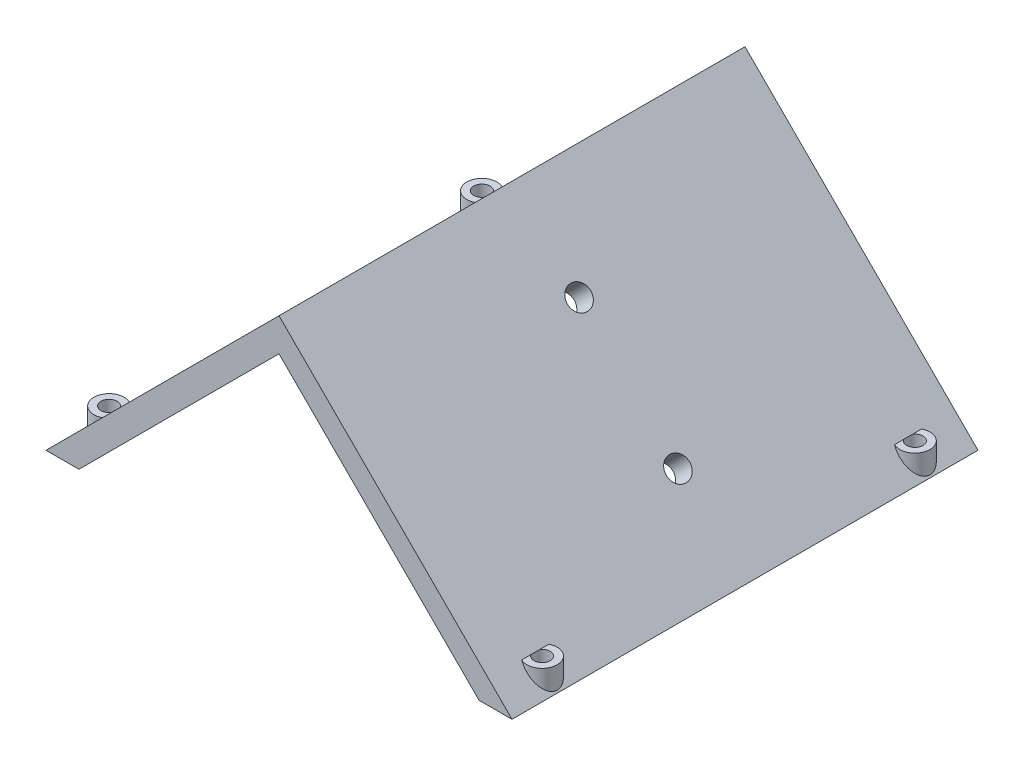
ISO-10303-21;
HEADER;
FILE_DESCRIPTION(('STEP AP214'),'2;1');
FILE_NAME('part.step','',(''),(''),'','','');
FILE_SCHEMA(('AUTOMOTIVE_DESIGN { 1 0 10303 214 1 1 1 1 }'));
ENDSEC;
DATA;
#1=APPLICATION_CONTEXT('core data for automotive mechanical design processes');
#2=APPLICATION_PROTOCOL_DEFINITION('international standard','automotive_design',2000,#1);
#3=PRODUCT_CONTEXT('',#1,'mechanical');
#4=PRODUCT('Part','Part','',(#3));
#5=PRODUCT_RELATED_PRODUCT_CATEGORY('part','',(#4));
#6=PRODUCT_DEFINITION_FORMATION('','',#4);
#7=PRODUCT_DEFINITION_CONTEXT('part definition',#1,'design');
#8=PRODUCT_DEFINITION('design','',#6,#7);
#9=PRODUCT_DEFINITION_SHAPE('','',#8);
#10=(LENGTH_UNIT() NAMED_UNIT(*) SI_UNIT(.MILLI.,.METRE.));
#11=(NAMED_UNIT(*) PLANE_ANGLE_UNIT() SI_UNIT($,.RADIAN.));
#12=(NAMED_UNIT(*) SI_UNIT($,.STERADIAN.) SOLID_ANGLE_UNIT());
#13=UNCERTAINTY_MEASURE_WITH_UNIT(LENGTH_MEASURE(1.E-05),#10,'distance_accuracy_value','');
#14=(GEOMETRIC_REPRESENTATION_CONTEXT(3) GLOBAL_UNCERTAINTY_ASSIGNED_CONTEXT((#13)) GLOBAL_UNIT_ASSIGNED_CONTEXT((#10,
#11,#12)) REPRESENTATION_CONTEXT('',''));
#15=CARTESIAN_POINT('',(0.,0.,0.));
#16=DIRECTION('',(0.,0.,1.));
#17=DIRECTION('',(1.,0.,0.));
#18=AXIS2_PLACEMENT_3D('',#15,#16,#17);
#19=CARTESIAN_POINT('',(0.,7.1,100.));
#20=DIRECTION('',(0.707106781186547,-0.707106781186548,0.));
#21=DIRECTION('',(0.707106781186548,0.707106781186547,0.));
#22=AXIS2_PLACEMENT_3D('',#19,#20,#21);
#23=PLANE('',#22);
#24=DIRECTION('',(0.,0.,-1.));
#25=VECTOR('',#24,1.);
#26=CARTESIAN_POINT('',(5.,12.1,100.));
#27=LINE('',#26,#25);
#28=CARTESIAN_POINT('',(5.,12.1,90.9580391742134));
#29=VERTEX_POINT('',#28);
#30=CARTESIAN_POINT('',(5.00000000000001,12.1,89.0419608257867));
#31=VERTEX_POINT('',#30);
#32=EDGE_CURVE('E136',#29,#31,#27,.T.);
#33=ORIENTED_EDGE('',*,*,#32,.F.);
#34=DIRECTION('',(0.,0.,-1.));
#35=VECTOR('',#34,1.);
#36=CARTESIAN_POINT('',(5.,12.1,100.));
#37=LINE('',#36,#35);
#38=CARTESIAN_POINT('',(5.,12.1,92.901351247148));
#39=VERTEX_POINT('',#38);
#40=EDGE_CURVE('E151',#39,#29,#37,.T.);
#41=ORIENTED_EDGE('',*,*,#40,.F.);
#42=CARTESIAN_POINT('',(3.53553390593275,10.6355339059327,90.));
#43=DIRECTION('',(0.707106781186547,-0.707106781186548,0.));
#44=DIRECTION('',(-0.707106781186548,-0.707106781186547,0.));
#45=AXIS2_PLACEMENT_3D('',#42,#43,#44);
#46=ELLIPSE('',#45,4.59619407771257,3.25000000000001);
#47=CARTESIAN_POINT('',(5.,12.1,87.098648752852));
#48=VERTEX_POINT('',#47);
#49=EDGE_CURVE('E165',#48,#39,#46,.F.);
#50=ORIENTED_EDGE('',*,*,#49,.F.);
#51=EDGE_CURVE('E261',#31,#48,#37,.T.);
#52=ORIENTED_EDGE('',*,*,#51,.F.);
#53=EDGE_LOOP('',(#33,#41,#50,#52));
#54=FACE_BOUND('',#53,.T.);
#55=DIRECTION('',(-0.707106781186548,-0.707106781186547,0.));
#56=VECTOR('',#55,1.);
#57=CARTESIAN_POINT('',(0.,7.1,0.));
#58=LINE('',#57,#56);
#59=CARTESIAN_POINT('',(50.,57.1,0.));
#60=VERTEX_POINT('',#59);
#61=CARTESIAN_POINT('',(0.,7.1,0.));
#62=VERTEX_POINT('',#61);
#63=EDGE_CURVE('E224',#60,#62,#58,.T.);
#64=ORIENTED_EDGE('',*,*,#63,.T.);
#65=DIRECTION('',(0.,0.,-1.));
#66=VECTOR('',#65,1.);
#67=CARTESIAN_POINT('',(0.,7.1,100.));
#68=LINE('',#67,#66);
#69=CARTESIAN_POINT('',(0.,7.1,100.));
#70=VERTEX_POINT('',#69);
#71=EDGE_CURVE('E239',#70,#62,#68,.T.);
#72=ORIENTED_EDGE('',*,*,#71,.F.);
#73=DIRECTION('',(-0.707106781186548,-0.707106781186547,0.));
#74=VECTOR('',#73,1.);
#75=CARTESIAN_POINT('',(0.,7.1,100.));
#76=LINE('',#75,#74);
#77=CARTESIAN_POINT('',(50.,57.1,100.));
#78=VERTEX_POINT('',#77);
#79=EDGE_CURVE('E209',#78,#70,#76,.T.);
#80=ORIENTED_EDGE('',*,*,#79,.F.);
#81=DIRECTION('',(0.,0.,-1.));
#82=VECTOR('',#81,1.);
#83=CARTESIAN_POINT('',(50.,57.1,100.));
#84=LINE('',#83,#82);
#85=EDGE_CURVE('E242',#78,#60,#84,.T.);
#86=ORIENTED_EDGE('',*,*,#85,.T.);
#87=EDGE_LOOP('',(#64,#72,#80,#86));
#88=FACE_BOUND('',#87,.T.);
#89=DIRECTION('',(0.,0.,-1.));
#90=VECTOR('',#89,1.);
#91=CARTESIAN_POINT('',(5.,12.1,100.));
#92=LINE('',#91,#90);
#93=CARTESIAN_POINT('',(5.,12.1,10.9580391742133));
#94=VERTEX_POINT('',#93);
#95=CARTESIAN_POINT('',(5.,12.1,9.04196082578667));
#96=VERTEX_POINT('',#95);
#97=EDGE_CURVE('E133',#94,#96,#92,.T.);
#98=ORIENTED_EDGE('',*,*,#97,.F.);
#99=DIRECTION('',(0.,0.,-1.));
#100=VECTOR('',#99,1.);
#101=CARTESIAN_POINT('',(5.,12.1,100.));
#102=LINE('',#101,#100);
#103=CARTESIAN_POINT('',(5.,12.1,12.901351247148));
#104=VERTEX_POINT('',#103);
#105=EDGE_CURVE('E11',#104,#94,#102,.T.);
#106=ORIENTED_EDGE('',*,*,#105,.F.);
#107=CARTESIAN_POINT('',(3.53553390593274,10.6355339059327,10.));
#108=DIRECTION('',(0.707106781186547,-0.707106781186548,0.));
#109=DIRECTION('',(-0.707106781186548,-0.707106781186547,0.));
#110=AXIS2_PLACEMENT_3D('',#107,#108,#109);
#111=ELLIPSE('',#110,4.59619407771257,3.25000000000001);
#112=CARTESIAN_POINT('',(5.,12.1,7.09864875285197));
#113=VERTEX_POINT('',#112);
#114=EDGE_CURVE('E147',#113,#104,#111,.F.);
#115=ORIENTED_EDGE('',*,*,#114,.F.);
#116=EDGE_CURVE('E41',#96,#113,#102,.T.);
#117=ORIENTED_EDGE('',*,*,#116,.F.);
#118=EDGE_LOOP('',(#98,#106,#115,#117));
#119=FACE_BOUND('',#118,.T.);
#120=ADVANCED_FACE('F37',(#54,#88,#119),#23,.F.);
#121=CARTESIAN_POINT('',(50.,57.1,100.));
#122=DIRECTION('',(-0.707106781186547,-0.707106781186548,0.));
#123=DIRECTION('',(0.707106781186548,-0.707106781186547,0.));
#124=AXIS2_PLACEMENT_3D('',#121,#122,#123);
#125=PLANE('',#124);
#126=DIRECTION('',(0.,0.,1.));
#127=VECTOR('',#126,1.);
#128=CARTESIAN_POINT('',(95.,12.1,100.));
#129=LINE('',#128,#127);
#130=CARTESIAN_POINT('',(95.,12.1,9.04196082578667));
#131=VERTEX_POINT('',#130);
#132=CARTESIAN_POINT('',(95.,12.1,10.9580391742133));
#133=VERTEX_POINT('',#132);
#134=EDGE_CURVE('E171',#131,#133,#129,.T.);
#135=ORIENTED_EDGE('',*,*,#134,.F.);
#136=DIRECTION('',(0.,0.,1.));
#137=VECTOR('',#136,1.);
#138=CARTESIAN_POINT('',(95.,12.1,100.));
#139=LINE('',#138,#137);
#140=CARTESIAN_POINT('',(95.,12.1,7.09864875285198));
#141=VERTEX_POINT('',#140);
#142=EDGE_CURVE('E260',#141,#131,#139,.T.);
#143=ORIENTED_EDGE('',*,*,#142,.F.);
#144=CARTESIAN_POINT('',(96.4644660940673,10.6355339059327,10.));
#145=DIRECTION('',(-0.707106781186547,-0.707106781186548,0.));
#146=DIRECTION('',(0.707106781186548,-0.707106781186547,0.));
#147=AXIS2_PLACEMENT_3D('',#144,#145,#146);
#148=ELLIPSE('',#147,4.59619407771256,3.25);
#149=CARTESIAN_POINT('',(95.,12.1,12.901351247148));
#150=VERTEX_POINT('',#149);
#151=EDGE_CURVE('E188',#141,#150,#148,.T.);
#152=ORIENTED_EDGE('',*,*,#151,.T.);
#153=EDGE_CURVE('E258',#133,#150,#139,.T.);
#154=ORIENTED_EDGE('',*,*,#153,.F.);
#155=EDGE_LOOP('',(#135,#143,#152,#154));
#156=FACE_BOUND('',#155,.T.);
#157=CARTESIAN_POINT('',(85.6066017177982,21.4933982822018,50.));
#158=DIRECTION('',(0.707106781186547,0.707106781186548,0.));
#159=DIRECTION('',(-0.707106781186548,0.707106781186547,0.));
#160=AXIS2_PLACEMENT_3D('',#157,#158,#159);
#161=CIRCLE('',#160,2.5);
#162=CARTESIAN_POINT('',(83.8388347648319,23.2611652351682,50.));
#163=VERTEX_POINT('',#162);
#164=EDGE_CURVE('E196',#163,#163,#161,.T.);
#165=ORIENTED_EDGE('',*,*,#164,.F.);
#166=EDGE_LOOP('',(#165));
#167=FACE_BOUND('',#166,.T.);
#168=CARTESIAN_POINT('',(64.3933982822018,42.7066017177982,50.));
#169=DIRECTION('',(0.707106781186547,0.707106781186548,0.));
#170=DIRECTION('',(-0.707106781186548,0.707106781186547,0.));
#171=AXIS2_PLACEMENT_3D('',#168,#169,#170);
#172=CIRCLE('',#171,2.5);
#173=CARTESIAN_POINT('',(62.6256313292354,44.4743686707646,50.));
#174=VERTEX_POINT('',#173);
#175=EDGE_CURVE('E199',#174,#174,#172,.T.);
#176=ORIENTED_EDGE('',*,*,#175,.F.);
#177=EDGE_LOOP('',(#176));
#178=FACE_BOUND('',#177,.T.);
#179=DIRECTION('',(-0.707106781186548,0.707106781186547,0.));
#180=VECTOR('',#179,1.);
#181=CARTESIAN_POINT('',(50.,57.1,0.));
#182=LINE('',#181,#180);
#183=CARTESIAN_POINT('',(100.,7.1,0.));
#184=VERTEX_POINT('',#183);
#185=EDGE_CURVE('E221',#184,#60,#182,.T.);
#186=ORIENTED_EDGE('',*,*,#185,.T.);
#187=ORIENTED_EDGE('',*,*,#85,.F.);
#188=DIRECTION('',(-0.707106781186548,0.707106781186547,0.));
#189=VECTOR('',#188,1.);
#190=CARTESIAN_POINT('',(50.,57.1,100.));
#191=LINE('',#190,#189);
#192=CARTESIAN_POINT('',(100.,7.1,100.));
#193=VERTEX_POINT('',#192);
#194=EDGE_CURVE('E206',#193,#78,#191,.T.);
#195=ORIENTED_EDGE('',*,*,#194,.F.);
#196=DIRECTION('',(0.,0.,-1.));
#197=VECTOR('',#196,1.);
#198=CARTESIAN_POINT('',(100.,7.1,100.));
#199=LINE('',#198,#197);
#200=EDGE_CURVE('E245',#193,#184,#199,.T.);
#201=ORIENTED_EDGE('',*,*,#200,.T.);
#202=EDGE_LOOP('',(#186,#187,#195,#201));
#203=FACE_BOUND('',#202,.T.);
#204=DIRECTION('',(0.,0.,1.));
#205=VECTOR('',#204,1.);
#206=CARTESIAN_POINT('',(95.,12.1,100.));
#207=LINE('',#206,#205);
#208=CARTESIAN_POINT('',(95.,12.1,89.0419608257867));
#209=VERTEX_POINT('',#208);
#210=CARTESIAN_POINT('',(95.,12.1,90.9580391742134));
#211=VERTEX_POINT('',#210);
#212=EDGE_CURVE('E180',#209,#211,#207,.T.);
#213=ORIENTED_EDGE('',*,*,#212,.F.);
#214=DIRECTION('',(0.,0.,1.));
#215=VECTOR('',#214,1.);
#216=CARTESIAN_POINT('',(95.,12.1,100.));
#217=LINE('',#216,#215);
#218=CARTESIAN_POINT('',(95.,12.1,87.098648752852));
#219=VERTEX_POINT('',#218);
#220=EDGE_CURVE('E256',#219,#209,#217,.T.);
#221=ORIENTED_EDGE('',*,*,#220,.F.);
#222=CARTESIAN_POINT('',(96.4644660940672,10.6355339059327,90.));
#223=DIRECTION('',(-0.707106781186547,-0.707106781186548,0.));
#224=DIRECTION('',(0.707106781186548,-0.707106781186547,0.));
#225=AXIS2_PLACEMENT_3D('',#222,#223,#224);
#226=ELLIPSE('',#225,4.59619407771256,3.25);
#227=CARTESIAN_POINT('',(95.,12.1,92.901351247148));
#228=VERTEX_POINT('',#227);
#229=EDGE_CURVE('E255',#219,#228,#226,.T.);
#230=ORIENTED_EDGE('',*,*,#229,.T.);
#231=EDGE_CURVE('E248',#211,#228,#217,.T.);
#232=ORIENTED_EDGE('',*,*,#231,.F.);
#233=EDGE_LOOP('',(#213,#221,#230,#232));
#234=FACE_BOUND('',#233,.T.);
#235=ADVANCED_FACE('F282',(#156,#167,#178,#203,#234),#125,.F.);
#236=CARTESIAN_POINT('',(92.9289321881345,7.1,100.));
#237=DIRECTION('',(0.,1.,0.));
#238=DIRECTION('',(-1.,0.,0.));
#239=AXIS2_PLACEMENT_3D('',#236,#237,#238);
#240=PLANE('',#239);
#241=CARTESIAN_POINT('',(96.4644660940672,7.1,90.));
#242=DIRECTION('',(0.,-1.,0.));
#243=DIRECTION('',(1.,0.,0.));
#244=AXIS2_PLACEMENT_3D('',#241,#242,#243);
#245=CIRCLE('',#244,1.75);
#246=CARTESIAN_POINT('',(98.2144660940672,7.1,90.));
#247=VERTEX_POINT('',#246);
#248=EDGE_CURVE('E172',#247,#247,#245,.T.);
#249=ORIENTED_EDGE('',*,*,#248,.F.);
#250=EDGE_LOOP('',(#249));
#251=FACE_BOUND('',#250,.T.);
#252=CARTESIAN_POINT('',(96.4644660940673,7.1,10.));
#253=DIRECTION('',(0.,-1.,0.));
#254=DIRECTION('',(1.,0.,0.));
#255=AXIS2_PLACEMENT_3D('',#252,#253,#254);
#256=CIRCLE('',#255,1.75);
#257=CARTESIAN_POINT('',(98.2144660940673,7.1,10.));
#258=VERTEX_POINT('',#257);
#259=EDGE_CURVE('E168',#258,#258,#256,.T.);
#260=ORIENTED_EDGE('',*,*,#259,.F.);
#261=EDGE_LOOP('',(#260));
#262=FACE_BOUND('',#261,.T.);
#263=DIRECTION('',(1.,0.,0.));
#264=VECTOR('',#263,1.);
#265=CARTESIAN_POINT('',(92.9289321881345,7.1,0.));
#266=LINE('',#265,#264);
#267=CARTESIAN_POINT('',(92.9289321881345,7.1,0.));
#268=VERTEX_POINT('',#267);
#269=EDGE_CURVE('E218',#268,#184,#266,.T.);
#270=ORIENTED_EDGE('',*,*,#269,.T.);
#271=ORIENTED_EDGE('',*,*,#200,.F.);
#272=DIRECTION('',(1.,0.,0.));
#273=VECTOR('',#272,1.);
#274=CARTESIAN_POINT('',(92.9289321881345,7.1,100.));
#275=LINE('',#274,#273);
#276=CARTESIAN_POINT('',(92.9289321881345,7.1,100.));
#277=VERTEX_POINT('',#276);
#278=EDGE_CURVE('E203',#277,#193,#275,.T.);
#279=ORIENTED_EDGE('',*,*,#278,.F.);
#280=DIRECTION('',(0.,0.,-1.));
#281=VECTOR('',#280,1.);
#282=CARTESIAN_POINT('',(92.9289321881345,7.1,100.));
#283=LINE('',#282,#281);
#284=EDGE_CURVE('E217',#277,#268,#283,.T.);
#285=ORIENTED_EDGE('',*,*,#284,.T.);
#286=EDGE_LOOP('',(#270,#271,#279,#285));
#287=FACE_BOUND('',#286,.T.);
#288=ADVANCED_FACE('F39',(#251,#262,#287),#240,.F.);
#289=CARTESIAN_POINT('',(0.,7.1,100.));
#290=DIRECTION('',(0.,1.,0.));
#291=DIRECTION('',(-1.,0.,0.));
#292=AXIS2_PLACEMENT_3D('',#289,#290,#291);
#293=PLANE('',#292);
#294=CARTESIAN_POINT('',(3.53553390593274,7.1,10.));
#295=DIRECTION('',(0.,-1.,0.));
#296=DIRECTION('',(1.,0.,0.));
#297=AXIS2_PLACEMENT_3D('',#294,#295,#296);
#298=CIRCLE('',#297,1.75);
#299=CARTESIAN_POINT('',(5.28553390593273,7.1,10.));
#300=VERTEX_POINT('',#299);
#301=EDGE_CURVE('E144',#300,#300,#298,.T.);
#302=ORIENTED_EDGE('',*,*,#301,.F.);
#303=EDGE_LOOP('',(#302));
#304=FACE_BOUND('',#303,.T.);
#305=CARTESIAN_POINT('',(3.53553390593275,7.1,90.));
#306=DIRECTION('',(0.,-1.,0.));
#307=DIRECTION('',(1.,0.,0.));
#308=AXIS2_PLACEMENT_3D('',#305,#306,#307);
#309=CIRCLE('',#308,1.75);
#310=CARTESIAN_POINT('',(5.28553390593275,7.1,90.));
#311=VERTEX_POINT('',#310);
#312=EDGE_CURVE('E551',#311,#311,#309,.T.);
#313=ORIENTED_EDGE('',*,*,#312,.F.);
#314=EDGE_LOOP('',(#313));
#315=FACE_BOUND('',#314,.T.);
#316=DIRECTION('',(1.,0.,0.));
#317=VECTOR('',#316,1.);
#318=CARTESIAN_POINT('',(0.,7.1,0.));
#319=LINE('',#318,#317);
#320=CARTESIAN_POINT('',(7.07106781186548,7.1,0.));
#321=VERTEX_POINT('',#320);
#322=EDGE_CURVE('E226',#62,#321,#319,.T.);
#323=ORIENTED_EDGE('',*,*,#322,.T.);
#324=DIRECTION('',(0.,0.,-1.));
#325=VECTOR('',#324,1.);
#326=CARTESIAN_POINT('',(7.07106781186548,7.1,100.));
#327=LINE('',#326,#325);
#328=CARTESIAN_POINT('',(7.07106781186548,7.1,100.));
#329=VERTEX_POINT('',#328);
#330=EDGE_CURVE('E236',#329,#321,#327,.T.);
#331=ORIENTED_EDGE('',*,*,#330,.F.);
#332=DIRECTION('',(1.,0.,0.));
#333=VECTOR('',#332,1.);
#334=CARTESIAN_POINT('',(0.,7.1,100.));
#335=LINE('',#334,#333);
#336=EDGE_CURVE('E211',#70,#329,#335,.T.);
#337=ORIENTED_EDGE('',*,*,#336,.F.);
#338=ORIENTED_EDGE('',*,*,#71,.T.);
#339=EDGE_LOOP('',(#323,#331,#337,#338));
#340=FACE_BOUND('',#339,.T.);
#341=ADVANCED_FACE('F306',(#304,#315,#340),#293,.F.);
#342=CARTESIAN_POINT('',(7.07106781186548,7.1,100.));
#343=DIRECTION('',(-0.707106781186547,0.707106781186547,0.));
#344=DIRECTION('',(-0.707106781186548,-0.707106781186548,0.));
#345=AXIS2_PLACEMENT_3D('',#342,#343,#344);
#346=PLANE('',#345);
#347=DIRECTION('',(0.707106781186547,0.707106781186547,0.));
#348=VECTOR('',#347,1.);
#349=CARTESIAN_POINT('',(7.07106781186548,7.1,0.));
#350=LINE('',#349,#348);
#351=CARTESIAN_POINT('',(50.,50.0289321881345,0.));
#352=VERTEX_POINT('',#351);
#353=EDGE_CURVE('E228',#321,#352,#350,.T.);
#354=ORIENTED_EDGE('',*,*,#353,.T.);
#355=DIRECTION('',(0.,0.,-1.));
#356=VECTOR('',#355,1.);
#357=CARTESIAN_POINT('',(50.,50.0289321881345,100.));
#358=LINE('',#357,#356);
#359=CARTESIAN_POINT('',(50.,50.0289321881345,100.));
#360=VERTEX_POINT('',#359);
#361=EDGE_CURVE('E233',#360,#352,#358,.T.);
#362=ORIENTED_EDGE('',*,*,#361,.F.);
#363=DIRECTION('',(0.707106781186547,0.707106781186547,0.));
#364=VECTOR('',#363,1.);
#365=CARTESIAN_POINT('',(7.07106781186548,7.1,100.));
#366=LINE('',#365,#364);
#367=EDGE_CURVE('E213',#329,#360,#366,.T.);
#368=ORIENTED_EDGE('',*,*,#367,.F.);
#369=ORIENTED_EDGE('',*,*,#330,.T.);
#370=EDGE_LOOP('',(#354,#362,#368,#369));
#371=FACE_BOUND('',#370,.T.);
#372=ADVANCED_FACE('F309',(#371),#346,.F.);
#373=CARTESIAN_POINT('',(50.,50.0289321881345,100.));
#374=DIRECTION('',(0.707106781186547,0.707106781186547,0.));
#375=DIRECTION('',(-0.707106781186548,0.707106781186548,0.));
#376=AXIS2_PLACEMENT_3D('',#373,#374,#375);
#377=PLANE('',#376);
#378=CARTESIAN_POINT('',(82.0710678118655,17.957864376269,50.));
#379=DIRECTION('',(0.707106781186547,0.707106781186547,0.));
#380=DIRECTION('',(-0.707106781186548,0.707106781186548,0.));
#381=AXIS2_PLACEMENT_3D('',#378,#379,#380);
#382=CIRCLE('',#381,2.5);
#383=CARTESIAN_POINT('',(80.3033008588991,19.7256313292354,50.));
#384=VERTEX_POINT('',#383);
#385=EDGE_CURVE('E222',#384,#384,#382,.T.);
#386=ORIENTED_EDGE('',*,*,#385,.T.);
#387=EDGE_LOOP('',(#386));
#388=FACE_BOUND('',#387,.T.);
#389=CARTESIAN_POINT('',(60.857864376269,39.1710678118655,50.));
#390=DIRECTION('',(0.707106781186547,0.707106781186547,0.));
#391=DIRECTION('',(-0.707106781186548,0.707106781186548,0.));
#392=AXIS2_PLACEMENT_3D('',#389,#390,#391);
#393=CIRCLE('',#392,2.5);
#394=CARTESIAN_POINT('',(59.0900974233027,40.9388347648318,50.));
#395=VERTEX_POINT('',#394);
#396=EDGE_CURVE('E202',#395,#395,#393,.T.);
#397=ORIENTED_EDGE('',*,*,#396,.T.);
#398=EDGE_LOOP('',(#397));
#399=FACE_BOUND('',#398,.T.);
#400=DIRECTION('',(0.707106781186547,-0.707106781186547,0.));
#401=VECTOR('',#400,1.);
#402=CARTESIAN_POINT('',(50.,50.0289321881345,0.));
#403=LINE('',#402,#401);
#404=EDGE_CURVE('E207',#352,#268,#403,.T.);
#405=ORIENTED_EDGE('',*,*,#404,.T.);
#406=ORIENTED_EDGE('',*,*,#284,.F.);
#407=DIRECTION('',(0.707106781186547,-0.707106781186547,0.));
#408=VECTOR('',#407,1.);
#409=CARTESIAN_POINT('',(50.,50.0289321881345,100.));
#410=LINE('',#409,#408);
#411=EDGE_CURVE('E215',#360,#277,#410,.T.);
#412=ORIENTED_EDGE('',*,*,#411,.F.);
#413=ORIENTED_EDGE('',*,*,#361,.T.);
#414=EDGE_LOOP('',(#405,#406,#412,#413));
#415=FACE_BOUND('',#414,.T.);
#416=ADVANCED_FACE('F313',(#388,#399,#415),#377,.F.);
#417=CARTESIAN_POINT('',(0.,0.,100.));
#418=DIRECTION('',(0.,0.,-1.));
#419=DIRECTION('',(-1.,0.,0.));
#420=AXIS2_PLACEMENT_3D('',#417,#418,#419);
#421=PLANE('',#420);
#422=ORIENTED_EDGE('',*,*,#278,.T.);
#423=ORIENTED_EDGE('',*,*,#194,.T.);
#424=ORIENTED_EDGE('',*,*,#79,.T.);
#425=ORIENTED_EDGE('',*,*,#336,.T.);
#426=ORIENTED_EDGE('',*,*,#367,.T.);
#427=ORIENTED_EDGE('',*,*,#411,.T.);
#428=EDGE_LOOP('',(#422,#423,#424,#425,#426,#427));
#429=FACE_BOUND('',#428,.T.);
#430=ADVANCED_FACE('F317',(#429),#421,.F.);
#431=CARTESIAN_POINT('',(0.,0.,0.));
#432=DIRECTION('',(0.,0.,-1.));
#433=DIRECTION('',(-1.,0.,0.));
#434=AXIS2_PLACEMENT_3D('',#431,#432,#433);
#435=PLANE('',#434);
#436=ORIENTED_EDGE('',*,*,#269,.F.);
#437=ORIENTED_EDGE('',*,*,#404,.F.);
#438=ORIENTED_EDGE('',*,*,#353,.F.);
#439=ORIENTED_EDGE('',*,*,#322,.F.);
#440=ORIENTED_EDGE('',*,*,#63,.F.);
#441=ORIENTED_EDGE('',*,*,#185,.F.);
#442=EDGE_LOOP('',(#436,#437,#438,#439,#440,#441));
#443=FACE_BOUND('',#442,.T.);
#444=ADVANCED_FACE('F319',(#443),#435,.T.);
#445=CARTESIAN_POINT('',(-6.31727983645294,-28.0040764008566,50.));
#446=DIRECTION('',(0.707106781186547,0.707106781186548,0.));
#447=DIRECTION('',(-0.707106781186548,0.707106781186547,0.));
#448=AXIS2_PLACEMENT_3D('',#445,#446,#447);
#449=CYLINDRICAL_SURFACE('',#448,2.5);
#450=ORIENTED_EDGE('',*,*,#175,.T.);
#451=EDGE_LOOP('',(#450));
#452=FACE_BOUND('',#451,.T.);
#453=ORIENTED_EDGE('',*,*,#396,.F.);
#454=EDGE_LOOP('',(#453));
#455=FACE_BOUND('',#454,.T.);
#456=ADVANCED_FACE('F322',(#452,#455),#449,.F.);
#457=CARTESIAN_POINT('',(14.8959235991435,-49.217279836453,50.));
#458=DIRECTION('',(0.707106781186547,0.707106781186548,0.));
#459=DIRECTION('',(-0.707106781186548,0.707106781186547,0.));
#460=AXIS2_PLACEMENT_3D('',#457,#458,#459);
#461=CYLINDRICAL_SURFACE('',#460,2.5);
#462=ORIENTED_EDGE('',*,*,#164,.T.);
#463=EDGE_LOOP('',(#462));
#464=FACE_BOUND('',#463,.T.);
#465=ORIENTED_EDGE('',*,*,#385,.F.);
#466=EDGE_LOOP('',(#465));
#467=FACE_BOUND('',#466,.T.);
#468=ADVANCED_FACE('F329',(#464,#467),#461,.F.);
#469=CARTESIAN_POINT('',(96.4644660940672,12.1,90.));
#470=DIRECTION('',(0.,-1.,0.));
#471=DIRECTION('',(1.,0.,0.));
#472=AXIS2_PLACEMENT_3D('',#469,#470,#471);
#473=CYLINDRICAL_SURFACE('',#472,1.75);
#474=CARTESIAN_POINT('',(96.4644660940672,12.1,90.));
#475=DIRECTION('',(0.,-1.,0.));
#476=DIRECTION('',(1.,0.,0.));
#477=AXIS2_PLACEMENT_3D('',#474,#475,#476);
#478=CIRCLE('',#477,1.75);
#479=EDGE_CURVE('E190',#209,#211,#478,.T.);
#480=ORIENTED_EDGE('',*,*,#479,.F.);
#481=CARTESIAN_POINT('',(96.4644660940672,12.1,90.));
#482=DIRECTION('',(0.,-1.,0.));
#483=DIRECTION('',(1.,0.,0.));
#484=AXIS2_PLACEMENT_3D('',#481,#482,#483);
#485=CIRCLE('',#484,1.75);
#486=EDGE_CURVE('E169',#211,#209,#485,.T.);
#487=ORIENTED_EDGE('',*,*,#486,.F.);
#488=EDGE_LOOP('',(#480,#487));
#489=FACE_BOUND('',#488,.T.);
#490=ORIENTED_EDGE('',*,*,#248,.T.);
#491=EDGE_LOOP('',(#490));
#492=FACE_BOUND('',#491,.T.);
#493=ADVANCED_FACE('F333',(#489,#492),#473,.F.);
#494=CARTESIAN_POINT('',(96.4644660940672,12.1,90.));
#495=DIRECTION('',(0.,-1.,0.));
#496=DIRECTION('',(1.,0.,0.));
#497=AXIS2_PLACEMENT_3D('',#494,#495,#496);
#498=CYLINDRICAL_SURFACE('',#497,3.25);
#499=ORIENTED_EDGE('',*,*,#229,.F.);
#500=CARTESIAN_POINT('',(96.4644660940672,12.1,90.));
#501=DIRECTION('',(0.,-1.,0.));
#502=DIRECTION('',(1.,0.,0.));
#503=AXIS2_PLACEMENT_3D('',#500,#501,#502);
#504=CIRCLE('',#503,3.25);
#505=EDGE_CURVE('E193',#219,#228,#504,.T.);
#506=ORIENTED_EDGE('',*,*,#505,.T.);
#507=EDGE_LOOP('',(#499,#506));
#508=FACE_BOUND('',#507,.T.);
#509=ADVANCED_FACE('F337',(#508),#498,.T.);
#510=CARTESIAN_POINT('',(0.,12.1,0.));
#511=DIRECTION('',(0.,-1.,0.));
#512=DIRECTION('',(1.,0.,0.));
#513=AXIS2_PLACEMENT_3D('',#510,#511,#512);
#514=PLANE('',#513);
#515=ORIENTED_EDGE('',*,*,#505,.F.);
#516=ORIENTED_EDGE('',*,*,#220,.T.);
#517=ORIENTED_EDGE('',*,*,#479,.T.);
#518=ORIENTED_EDGE('',*,*,#231,.T.);
#519=EDGE_LOOP('',(#515,#516,#517,#518));
#520=FACE_BOUND('',#519,.T.);
#521=ADVANCED_FACE('F341',(#520),#514,.F.);
#522=CARTESIAN_POINT('',(0.,12.1,0.));
#523=DIRECTION('',(0.,-1.,0.));
#524=DIRECTION('',(1.,0.,0.));
#525=AXIS2_PLACEMENT_3D('',#522,#523,#524);
#526=PLANE('',#525);
#527=CARTESIAN_POINT('',(96.4644660940673,12.1,10.));
#528=DIRECTION('',(0.,-1.,0.));
#529=DIRECTION('',(1.,0.,0.));
#530=AXIS2_PLACEMENT_3D('',#527,#528,#529);
#531=CIRCLE('',#530,3.25);
#532=EDGE_CURVE('E185',#141,#150,#531,.T.);
#533=ORIENTED_EDGE('',*,*,#532,.F.);
#534=ORIENTED_EDGE('',*,*,#142,.T.);
#535=CARTESIAN_POINT('',(96.4644660940673,12.1,10.));
#536=DIRECTION('',(0.,-1.,0.));
#537=DIRECTION('',(1.,0.,0.));
#538=AXIS2_PLACEMENT_3D('',#535,#536,#537);
#539=CIRCLE('',#538,1.75);
#540=EDGE_CURVE('E182',#131,#133,#539,.T.);
#541=ORIENTED_EDGE('',*,*,#540,.T.);
#542=ORIENTED_EDGE('',*,*,#153,.T.);
#543=EDGE_LOOP('',(#533,#534,#541,#542));
#544=FACE_BOUND('',#543,.T.);
#545=ADVANCED_FACE('F272',(#544),#526,.F.);
#546=CARTESIAN_POINT('',(96.4644660940673,12.1,10.));
#547=DIRECTION('',(0.,-1.,0.));
#548=DIRECTION('',(1.,0.,0.));
#549=AXIS2_PLACEMENT_3D('',#546,#547,#548);
#550=CYLINDRICAL_SURFACE('',#549,1.75);
#551=ORIENTED_EDGE('',*,*,#540,.F.);
#552=CARTESIAN_POINT('',(96.4644660940673,12.1,10.));
#553=DIRECTION('',(0.,-1.,0.));
#554=DIRECTION('',(1.,0.,0.));
#555=AXIS2_PLACEMENT_3D('',#552,#553,#554);
#556=CIRCLE('',#555,1.75);
#557=EDGE_CURVE('E175',#133,#131,#556,.T.);
#558=ORIENTED_EDGE('',*,*,#557,.F.);
#559=EDGE_LOOP('',(#551,#558));
#560=FACE_BOUND('',#559,.T.);
#561=ORIENTED_EDGE('',*,*,#259,.T.);
#562=EDGE_LOOP('',(#561));
#563=FACE_BOUND('',#562,.T.);
#564=ADVANCED_FACE('F278',(#560,#563),#550,.F.);
#565=CARTESIAN_POINT('',(96.4644660940673,12.1,10.));
#566=DIRECTION('',(0.,-1.,0.));
#567=DIRECTION('',(1.,0.,0.));
#568=AXIS2_PLACEMENT_3D('',#565,#566,#567);
#569=CYLINDRICAL_SURFACE('',#568,3.25);
#570=ORIENTED_EDGE('',*,*,#151,.F.);
#571=ORIENTED_EDGE('',*,*,#532,.T.);
#572=EDGE_LOOP('',(#570,#571));
#573=FACE_BOUND('',#572,.T.);
#574=ADVANCED_FACE('F285',(#573),#569,.T.);
#575=CARTESIAN_POINT('',(0.,12.1,0.));
#576=DIRECTION('',(0.,-1.,0.));
#577=DIRECTION('',(1.,0.,0.));
#578=AXIS2_PLACEMENT_3D('',#575,#576,#577);
#579=PLANE('',#578);
#580=ORIENTED_EDGE('',*,*,#134,.T.);
#581=ORIENTED_EDGE('',*,*,#557,.T.);
#582=EDGE_LOOP('',(#580,#581));
#583=FACE_BOUND('',#582,.T.);
#584=ADVANCED_FACE('F287',(#583),#579,.T.);
#585=CARTESIAN_POINT('',(0.,12.1,0.));
#586=DIRECTION('',(0.,-1.,0.));
#587=DIRECTION('',(1.,0.,0.));
#588=AXIS2_PLACEMENT_3D('',#585,#586,#587);
#589=PLANE('',#588);
#590=ORIENTED_EDGE('',*,*,#212,.T.);
#591=ORIENTED_EDGE('',*,*,#486,.T.);
#592=EDGE_LOOP('',(#590,#591));
#593=FACE_BOUND('',#592,.T.);
#594=ADVANCED_FACE('F293',(#593),#589,.T.);
#595=CARTESIAN_POINT('',(0.,12.1,0.));
#596=DIRECTION('',(0.,-1.,0.));
#597=DIRECTION('',(1.,0.,0.));
#598=AXIS2_PLACEMENT_3D('',#595,#596,#597);
#599=PLANE('',#598);
#600=CARTESIAN_POINT('',(3.53553390593275,12.1,90.));
#601=DIRECTION('',(0.,-1.,0.));
#602=DIRECTION('',(1.,0.,0.));
#603=AXIS2_PLACEMENT_3D('',#600,#601,#602);
#604=CIRCLE('',#603,3.25000000000001);
#605=EDGE_CURVE('E155',#48,#39,#604,.F.);
#606=ORIENTED_EDGE('',*,*,#605,.T.);
#607=ORIENTED_EDGE('',*,*,#40,.T.);
#608=CARTESIAN_POINT('',(3.53553390593275,12.1,90.));
#609=DIRECTION('',(0.,-1.,0.));
#610=DIRECTION('',(1.,0.,0.));
#611=AXIS2_PLACEMENT_3D('',#608,#609,#610);
#612=CIRCLE('',#611,1.75);
#613=EDGE_CURVE('E162',#31,#29,#612,.F.);
#614=ORIENTED_EDGE('',*,*,#613,.F.);
#615=ORIENTED_EDGE('',*,*,#51,.T.);
#616=EDGE_LOOP('',(#606,#607,#614,#615));
#617=FACE_BOUND('',#616,.T.);
#618=ADVANCED_FACE('F463',(#617),#599,.F.);
#619=CARTESIAN_POINT('',(3.53553390593275,12.1,90.));
#620=DIRECTION('',(0.,-1.,0.));
#621=DIRECTION('',(1.,0.,0.));
#622=AXIS2_PLACEMENT_3D('',#619,#620,#621);
#623=CYLINDRICAL_SURFACE('',#622,3.25000000000001);
#624=ORIENTED_EDGE('',*,*,#605,.F.);
#625=ORIENTED_EDGE('',*,*,#49,.T.);
#626=EDGE_LOOP('',(#624,#625));
#627=FACE_BOUND('',#626,.T.);
#628=ADVANCED_FACE('F471',(#627),#623,.T.);
#629=CARTESIAN_POINT('',(3.53553390593275,12.1,90.));
#630=DIRECTION('',(0.,-1.,0.));
#631=DIRECTION('',(1.,0.,0.));
#632=AXIS2_PLACEMENT_3D('',#629,#630,#631);
#633=CYLINDRICAL_SURFACE('',#632,1.75);
#634=ORIENTED_EDGE('',*,*,#613,.T.);
#635=CARTESIAN_POINT('',(3.53553390593275,12.1,90.));
#636=DIRECTION('',(0.,-1.,0.));
#637=DIRECTION('',(1.,0.,0.));
#638=AXIS2_PLACEMENT_3D('',#635,#636,#637);
#639=CIRCLE('',#638,1.75);
#640=EDGE_CURVE('E549',#31,#29,#639,.T.);
#641=ORIENTED_EDGE('',*,*,#640,.F.);
#642=EDGE_LOOP('',(#634,#641));
#643=FACE_BOUND('',#642,.T.);
#644=ORIENTED_EDGE('',*,*,#312,.T.);
#645=EDGE_LOOP('',(#644));
#646=FACE_BOUND('',#645,.T.);
#647=ADVANCED_FACE('F479',(#643,#646),#633,.F.);
#648=CARTESIAN_POINT('',(0.,12.1,0.));
#649=DIRECTION('',(0.,-1.,0.));
#650=DIRECTION('',(1.,0.,0.));
#651=AXIS2_PLACEMENT_3D('',#648,#649,#650);
#652=PLANE('',#651);
#653=CARTESIAN_POINT('',(3.53553390593274,12.1,10.));
#654=DIRECTION('',(0.,-1.,0.));
#655=DIRECTION('',(1.,0.,0.));
#656=AXIS2_PLACEMENT_3D('',#653,#654,#655);
#657=CIRCLE('',#656,3.25000000000001);
#658=EDGE_CURVE('E153',#113,#104,#657,.F.);
#659=ORIENTED_EDGE('',*,*,#658,.T.);
#660=ORIENTED_EDGE('',*,*,#105,.T.);
#661=CARTESIAN_POINT('',(3.53553390593274,12.1,10.));
#662=DIRECTION('',(0.,-1.,0.));
#663=DIRECTION('',(1.,0.,0.));
#664=AXIS2_PLACEMENT_3D('',#661,#662,#663);
#665=CIRCLE('',#664,1.75);
#666=EDGE_CURVE('E143',#96,#94,#665,.F.);
#667=ORIENTED_EDGE('',*,*,#666,.F.);
#668=ORIENTED_EDGE('',*,*,#116,.T.);
#669=EDGE_LOOP('',(#659,#660,#667,#668));
#670=FACE_BOUND('',#669,.T.);
#671=ADVANCED_FACE('F152',(#670),#652,.F.);
#672=CARTESIAN_POINT('',(3.53553390593274,12.1,10.));
#673=DIRECTION('',(0.,-1.,0.));
#674=DIRECTION('',(1.,0.,0.));
#675=AXIS2_PLACEMENT_3D('',#672,#673,#674);
#676=CYLINDRICAL_SURFACE('',#675,3.25000000000001);
#677=ORIENTED_EDGE('',*,*,#658,.F.);
#678=ORIENTED_EDGE('',*,*,#114,.T.);
#679=EDGE_LOOP('',(#677,#678));
#680=FACE_BOUND('',#679,.T.);
#681=ADVANCED_FACE('F500',(#680),#676,.T.);
#682=CARTESIAN_POINT('',(3.53553390593274,12.1,10.));
#683=DIRECTION('',(0.,-1.,0.));
#684=DIRECTION('',(1.,0.,0.));
#685=AXIS2_PLACEMENT_3D('',#682,#683,#684);
#686=CYLINDRICAL_SURFACE('',#685,1.75);
#687=ORIENTED_EDGE('',*,*,#666,.T.);
#688=CARTESIAN_POINT('',(3.53553390593274,12.1,10.));
#689=DIRECTION('',(0.,-1.,0.));
#690=DIRECTION('',(1.,0.,0.));
#691=AXIS2_PLACEMENT_3D('',#688,#689,#690);
#692=CIRCLE('',#691,1.75);
#693=EDGE_CURVE('E57',#96,#94,#692,.T.);
#694=ORIENTED_EDGE('',*,*,#693,.F.);
#695=EDGE_LOOP('',(#687,#694));
#696=FACE_BOUND('',#695,.T.);
#697=ORIENTED_EDGE('',*,*,#301,.T.);
#698=EDGE_LOOP('',(#697));
#699=FACE_BOUND('',#698,.T.);
#700=ADVANCED_FACE('F140',(#696,#699),#686,.F.);
#701=CARTESIAN_POINT('',(0.,12.1,0.));
#702=DIRECTION('',(0.,-1.,0.));
#703=DIRECTION('',(1.,0.,0.));
#704=AXIS2_PLACEMENT_3D('',#701,#702,#703);
#705=PLANE('',#704);
#706=ORIENTED_EDGE('',*,*,#32,.T.);
#707=ORIENTED_EDGE('',*,*,#640,.T.);
#708=EDGE_LOOP('',(#706,#707));
#709=FACE_BOUND('',#708,.T.);
#710=ADVANCED_FACE('F514',(#709),#705,.T.);
#711=CARTESIAN_POINT('',(0.,12.1,0.));
#712=DIRECTION('',(0.,-1.,0.));
#713=DIRECTION('',(1.,0.,0.));
#714=AXIS2_PLACEMENT_3D('',#711,#712,#713);
#715=PLANE('',#714);
#716=ORIENTED_EDGE('',*,*,#97,.T.);
#717=ORIENTED_EDGE('',*,*,#693,.T.);
#718=EDGE_LOOP('',(#716,#717));
#719=FACE_BOUND('',#718,.T.);
#720=ADVANCED_FACE('F134',(#719),#715,.T.);
#721=CLOSED_SHELL('',(#120,#235,#288,#341,#372,#416,#430,#444,#456,#468,#493,#509,#521,#545,
#564,#574,#584,#594,#618,#628,#647,#671,#681,#700,#710,#720));
#722=MANIFOLD_SOLID_BREP('B2',#721);
#723=ADVANCED_BREP_SHAPE_REPRESENTATION('',(#18,#722),#14);
#724=SHAPE_DEFINITION_REPRESENTATION(#9,#723);
ENDSEC;
END-ISO-10303-21;
